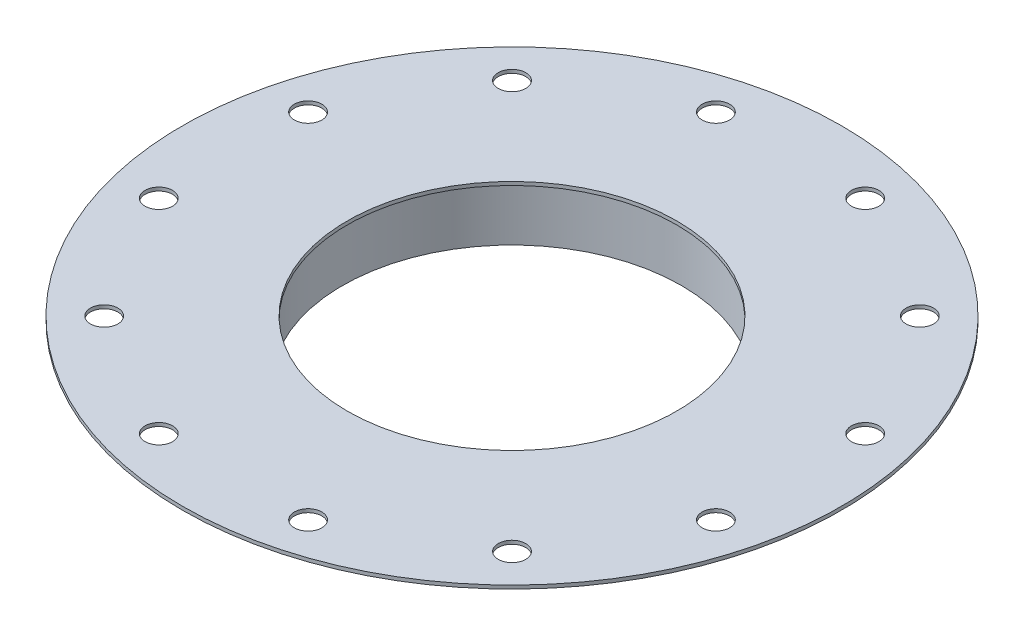
ISO-10303-21;
HEADER;
FILE_DESCRIPTION(('STEP AP214'),'2;1');
FILE_NAME('part.step','',(''),(''),'','','');
FILE_SCHEMA(('AUTOMOTIVE_DESIGN { 1 0 10303 214 1 1 1 1 }'));
ENDSEC;
DATA;
#1=APPLICATION_CONTEXT('core data for automotive mechanical design processes');
#2=APPLICATION_PROTOCOL_DEFINITION('international standard','automotive_design',2000,#1);
#3=PRODUCT_CONTEXT('',#1,'mechanical');
#4=PRODUCT('Part','Part','',(#3));
#5=PRODUCT_RELATED_PRODUCT_CATEGORY('part','',(#4));
#6=PRODUCT_DEFINITION_FORMATION('','',#4);
#7=PRODUCT_DEFINITION_CONTEXT('part definition',#1,'design');
#8=PRODUCT_DEFINITION('design','',#6,#7);
#9=PRODUCT_DEFINITION_SHAPE('','',#8);
#10=(LENGTH_UNIT() NAMED_UNIT(*) SI_UNIT(.MILLI.,.METRE.));
#11=(NAMED_UNIT(*) PLANE_ANGLE_UNIT() SI_UNIT($,.RADIAN.));
#12=(NAMED_UNIT(*) SI_UNIT($,.STERADIAN.) SOLID_ANGLE_UNIT());
#13=UNCERTAINTY_MEASURE_WITH_UNIT(LENGTH_MEASURE(1.E-05),#10,'distance_accuracy_value','');
#14=(GEOMETRIC_REPRESENTATION_CONTEXT(3) GLOBAL_UNCERTAINTY_ASSIGNED_CONTEXT((#13)) GLOBAL_UNIT_ASSIGNED_CONTEXT((#10,
#11,#12)) REPRESENTATION_CONTEXT('',''));
#15=CARTESIAN_POINT('',(0.,0.,0.));
#16=DIRECTION('',(0.,0.,1.));
#17=DIRECTION('',(1.,0.,0.));
#18=AXIS2_PLACEMENT_3D('',#15,#16,#17);
#19=CARTESIAN_POINT('',(0.,0.,0.));
#20=DIRECTION('',(0.,1.,0.));
#21=DIRECTION('',(0.,0.,1.));
#22=AXIS2_PLACEMENT_3D('',#19,#20,#21);
#23=PLANE('',#22);
#24=CARTESIAN_POINT('',(0.,0.,0.));
#25=DIRECTION('',(0.,1.,0.));
#26=DIRECTION('',(0.,0.,1.));
#27=AXIS2_PLACEMENT_3D('',#24,#25,#26);
#28=CIRCLE('',#27,300.);
#29=CARTESIAN_POINT('',(0.,0.,300.));
#30=VERTEX_POINT('',#29);
#31=EDGE_CURVE('E89',#30,#30,#28,.F.);
#32=ORIENTED_EDGE('',*,*,#31,.F.);
#33=EDGE_LOOP('',(#32));
#34=FACE_BOUND('',#33,.T.);
#35=CARTESIAN_POINT('',(0.,0.,0.));
#36=DIRECTION('',(0.,-1.,0.));
#37=DIRECTION('',(0.,0.,-1.));
#38=AXIS2_PLACEMENT_3D('',#35,#36,#37);
#39=CIRCLE('',#38,308.65);
#40=CARTESIAN_POINT('',(0.,0.,-308.65));
#41=VERTEX_POINT('',#40);
#42=EDGE_CURVE('E174',#41,#41,#39,.T.);
#43=ORIENTED_EDGE('',*,*,#42,.T.);
#44=EDGE_LOOP('',(#43));
#45=FACE_BOUND('',#44,.T.);
#46=ADVANCED_FACE('F69',(#34,#45),#23,.F.);
#47=CARTESIAN_POINT('',(0.,6.35,0.));
#48=DIRECTION('',(0.,-1.,0.));
#49=DIRECTION('',(0.,0.,-1.));
#50=AXIS2_PLACEMENT_3D('',#47,#48,#49);
#51=CYLINDRICAL_SURFACE('',#50,600.);
#52=CARTESIAN_POINT('',(0.,0.,0.));
#53=DIRECTION('',(0.,1.,0.));
#54=DIRECTION('',(0.,0.,1.));
#55=AXIS2_PLACEMENT_3D('',#52,#53,#54);
#56=CIRCLE('',#55,600.);
#57=CARTESIAN_POINT('',(0.,0.,600.));
#58=VERTEX_POINT('',#57);
#59=EDGE_CURVE('E85',#58,#58,#56,.T.);
#60=ORIENTED_EDGE('',*,*,#59,.T.);
#61=EDGE_LOOP('',(#60));
#62=FACE_BOUND('',#61,.T.);
#63=CARTESIAN_POINT('',(0.,6.35,0.));
#64=DIRECTION('',(0.,1.,0.));
#65=DIRECTION('',(0.,0.,1.));
#66=AXIS2_PLACEMENT_3D('',#63,#64,#65);
#67=CIRCLE('',#66,600.);
#68=CARTESIAN_POINT('',(0.,6.35,600.));
#69=VERTEX_POINT('',#68);
#70=EDGE_CURVE('E76',#69,#69,#67,.T.);
#71=ORIENTED_EDGE('',*,*,#70,.F.);
#72=EDGE_LOOP('',(#71));
#73=FACE_BOUND('',#72,.T.);
#74=ADVANCED_FACE('F140',(#62,#73),#51,.T.);
#75=CARTESIAN_POINT('',(0.,6.35,0.));
#76=DIRECTION('',(0.,-1.,0.));
#77=DIRECTION('',(0.,0.,-1.));
#78=AXIS2_PLACEMENT_3D('',#75,#76,#77);
#79=CYLINDRICAL_SURFACE('',#78,300.);
#80=CARTESIAN_POINT('',(0.,6.35,0.));
#81=DIRECTION('',(0.,1.,0.));
#82=DIRECTION('',(0.,0.,1.));
#83=AXIS2_PLACEMENT_3D('',#80,#81,#82);
#84=CIRCLE('',#83,300.);
#85=CARTESIAN_POINT('',(0.,6.35,300.));
#86=VERTEX_POINT('',#85);
#87=EDGE_CURVE('E80',#86,#86,#84,.F.);
#88=ORIENTED_EDGE('',*,*,#87,.F.);
#89=EDGE_LOOP('',(#88));
#90=FACE_BOUND('',#89,.T.);
#91=ORIENTED_EDGE('',*,*,#31,.T.);
#92=EDGE_LOOP('',(#91));
#93=FACE_BOUND('',#92,.T.);
#94=ADVANCED_FACE('F71',(#90,#93),#79,.F.);
#95=CARTESIAN_POINT('',(0.,0.,0.));
#96=DIRECTION('',(0.,1.,0.));
#97=DIRECTION('',(0.,0.,1.));
#98=AXIS2_PLACEMENT_3D('',#95,#96,#97);
#99=CIRCLE('',#98,315.);
#100=CARTESIAN_POINT('',(0.,0.,315.));
#101=VERTEX_POINT('',#100);
#102=EDGE_CURVE('E11',#101,#101,#99,.F.);
#103=ORIENTED_EDGE('',*,*,#102,.F.);
#104=EDGE_LOOP('',(#103));
#105=FACE_BOUND('',#104,.T.);
#106=CARTESIAN_POINT('',(-507.111058801756,0.,-135.879998678842));
#107=DIRECTION('',(0.,1.,0.));
#108=DIRECTION('',(0.,0.,1.));
#109=AXIS2_PLACEMENT_3D('',#106,#107,#108);
#110=CIRCLE('',#109,25.);
#111=CARTESIAN_POINT('',(-507.111058801756,0.,-110.879998678842));
#112=VERTEX_POINT('',#111);
#113=EDGE_CURVE('E188',#112,#112,#110,.T.);
#114=ORIENTED_EDGE('',*,*,#113,.T.);
#115=EDGE_LOOP('',(#114));
#116=FACE_BOUND('',#115,.T.);
#117=CARTESIAN_POINT('',(135.879998678691,0.,507.111058801796));
#118=DIRECTION('',(0.,1.,0.));
#119=DIRECTION('',(0.,0.,1.));
#120=AXIS2_PLACEMENT_3D('',#117,#118,#119);
#121=CIRCLE('',#120,25.);
#122=CARTESIAN_POINT('',(135.879998678691,0.,532.111058801796));
#123=VERTEX_POINT('',#122);
#124=EDGE_CURVE('E201',#123,#123,#121,.T.);
#125=ORIENTED_EDGE('',*,*,#124,.T.);
#126=EDGE_LOOP('',(#125));
#127=FACE_BOUND('',#126,.T.);
#128=CARTESIAN_POINT('',(371.23106012286,0.,371.231060123015));
#129=DIRECTION('',(0.,1.,0.));
#130=DIRECTION('',(0.,0.,1.));
#131=AXIS2_PLACEMENT_3D('',#128,#129,#130);
#132=CIRCLE('',#131,25.0000000000001);
#133=CARTESIAN_POINT('',(371.23106012286,0.,396.231060123015));
#134=VERTEX_POINT('',#133);
#135=EDGE_CURVE('E198',#134,#134,#132,.T.);
#136=ORIENTED_EDGE('',*,*,#135,.T.);
#137=EDGE_LOOP('',(#136));
#138=FACE_BOUND('',#137,.T.);
#139=CARTESIAN_POINT('',(507.11105880174,0.,135.879998678902));
#140=DIRECTION('',(0.,1.,0.));
#141=DIRECTION('',(0.,0.,1.));
#142=AXIS2_PLACEMENT_3D('',#139,#140,#141);
#143=CIRCLE('',#142,25.);
#144=CARTESIAN_POINT('',(507.11105880174,0.,160.879998678902));
#145=VERTEX_POINT('',#144);
#146=EDGE_CURVE('E194',#145,#145,#143,.T.);
#147=ORIENTED_EDGE('',*,*,#146,.T.);
#148=EDGE_LOOP('',(#147));
#149=FACE_BOUND('',#148,.T.);
#150=CARTESIAN_POINT('',(507.111058801775,0.,-135.879998678772));
#151=DIRECTION('',(0.,1.,0.));
#152=DIRECTION('',(0.,0.,1.));
#153=AXIS2_PLACEMENT_3D('',#150,#151,#152);
#154=CIRCLE('',#153,25.);
#155=CARTESIAN_POINT('',(507.111058801775,0.,-110.879998678773));
#156=VERTEX_POINT('',#155);
#157=EDGE_CURVE('E197',#156,#156,#154,.T.);
#158=ORIENTED_EDGE('',*,*,#157,.T.);
#159=EDGE_LOOP('',(#158));
#160=FACE_BOUND('',#159,.T.);
#161=CARTESIAN_POINT('',(371.231060122955,0.,-371.23106012292));
#162=DIRECTION('',(0.,1.,0.));
#163=DIRECTION('',(0.,0.,1.));
#164=AXIS2_PLACEMENT_3D('',#161,#162,#163);
#165=CIRCLE('',#164,25.0000000000001);
#166=CARTESIAN_POINT('',(371.231060122955,0.,-346.23106012292));
#167=VERTEX_POINT('',#166);
#168=EDGE_CURVE('E212',#167,#167,#165,.T.);
#169=ORIENTED_EDGE('',*,*,#168,.T.);
#170=EDGE_LOOP('',(#169));
#171=FACE_BOUND('',#170,.T.);
#172=CARTESIAN_POINT('',(-371.231060122929,0.,-371.231060122946));
#173=DIRECTION('',(0.,1.,0.));
#174=DIRECTION('',(0.,0.,1.));
#175=AXIS2_PLACEMENT_3D('',#172,#173,#174);
#176=CIRCLE('',#175,24.9999999999999);
#177=CARTESIAN_POINT('',(-371.231060122929,0.,-346.231060122946));
#178=VERTEX_POINT('',#177);
#179=EDGE_CURVE('E209',#178,#178,#176,.T.);
#180=ORIENTED_EDGE('',*,*,#179,.T.);
#181=EDGE_LOOP('',(#180));
#182=FACE_BOUND('',#181,.T.);
#183=CARTESIAN_POINT('',(-135.879998678819,0.,-507.111058801762));
#184=DIRECTION('',(0.,1.,0.));
#185=DIRECTION('',(0.,0.,1.));
#186=AXIS2_PLACEMENT_3D('',#183,#184,#185);
#187=CIRCLE('',#186,25.0000000000001);
#188=CARTESIAN_POINT('',(-135.879998678819,0.,-482.111058801762));
#189=VERTEX_POINT('',#188);
#190=EDGE_CURVE('E206',#189,#189,#187,.T.);
#191=ORIENTED_EDGE('',*,*,#190,.T.);
#192=EDGE_LOOP('',(#191));
#193=FACE_BOUND('',#192,.T.);
#194=CARTESIAN_POINT('',(-507.111058801768,0.,135.879998678797));
#195=DIRECTION('',(0.,1.,0.));
#196=DIRECTION('',(0.,0.,1.));
#197=AXIS2_PLACEMENT_3D('',#194,#195,#196);
#198=CIRCLE('',#197,25.);
#199=CARTESIAN_POINT('',(-507.111058801768,0.,160.879998678797));
#200=VERTEX_POINT('',#199);
#201=EDGE_CURVE('E185',#200,#200,#198,.T.);
#202=ORIENTED_EDGE('',*,*,#201,.T.);
#203=EDGE_LOOP('',(#202));
#204=FACE_BOUND('',#203,.T.);
#205=CARTESIAN_POINT('',(-371.231060122962,0.,371.231060122913));
#206=DIRECTION('',(0.,1.,0.));
#207=DIRECTION('',(0.,0.,1.));
#208=AXIS2_PLACEMENT_3D('',#205,#206,#207);
#209=CIRCLE('',#208,25.);
#210=CARTESIAN_POINT('',(-371.231060122962,0.,396.231060122913));
#211=VERTEX_POINT('',#210);
#212=EDGE_CURVE('E189',#211,#211,#209,.T.);
#213=ORIENTED_EDGE('',*,*,#212,.T.);
#214=EDGE_LOOP('',(#213));
#215=FACE_BOUND('',#214,.T.);
#216=CARTESIAN_POINT('',(-135.879998678864,0.,507.11105880175));
#217=DIRECTION('',(0.,1.,0.));
#218=DIRECTION('',(0.,0.,1.));
#219=AXIS2_PLACEMENT_3D('',#216,#217,#218);
#220=CIRCLE('',#219,25.);
#221=CARTESIAN_POINT('',(-135.879998678864,0.,532.11105880175));
#222=VERTEX_POINT('',#221);
#223=EDGE_CURVE('E184',#222,#222,#220,.T.);
#224=ORIENTED_EDGE('',*,*,#223,.T.);
#225=EDGE_LOOP('',(#224));
#226=FACE_BOUND('',#225,.T.);
#227=CARTESIAN_POINT('',(135.87999867882,0.,-507.111058801762));
#228=DIRECTION('',(0.,1.,0.));
#229=DIRECTION('',(0.,0.,1.));
#230=AXIS2_PLACEMENT_3D('',#227,#228,#229);
#231=CIRCLE('',#230,25.0000000000001);
#232=CARTESIAN_POINT('',(135.87999867882,0.,-482.111058801762));
#233=VERTEX_POINT('',#232);
#234=EDGE_CURVE('E99',#233,#233,#231,.T.);
#235=ORIENTED_EDGE('',*,*,#234,.T.);
#236=EDGE_LOOP('',(#235));
#237=FACE_BOUND('',#236,.T.);
#238=ORIENTED_EDGE('',*,*,#59,.F.);
#239=EDGE_LOOP('',(#238));
#240=FACE_BOUND('',#239,.T.);
#241=ADVANCED_FACE('F138',(#105,#116,#127,#138,#149,#160,#171,#182,#193,#204,#215,#226,#237,
#240),#23,.F.);
#242=CARTESIAN_POINT('',(0.,6.35,0.));
#243=DIRECTION('',(0.,1.,0.));
#244=DIRECTION('',(0.,0.,1.));
#245=AXIS2_PLACEMENT_3D('',#242,#243,#244);
#246=PLANE('',#245);
#247=CARTESIAN_POINT('',(-507.111058801756,6.35,-135.879998678842));
#248=DIRECTION('',(0.,1.,0.));
#249=DIRECTION('',(0.,0.,1.));
#250=AXIS2_PLACEMENT_3D('',#247,#248,#249);
#251=CIRCLE('',#250,25.);
#252=CARTESIAN_POINT('',(-507.111058801756,6.35,-110.879998678842));
#253=VERTEX_POINT('',#252);
#254=EDGE_CURVE('E92',#253,#253,#251,.T.);
#255=ORIENTED_EDGE('',*,*,#254,.F.);
#256=EDGE_LOOP('',(#255));
#257=FACE_BOUND('',#256,.T.);
#258=CARTESIAN_POINT('',(135.879998678691,6.35,507.111058801796));
#259=DIRECTION('',(0.,1.,0.));
#260=DIRECTION('',(0.,0.,1.));
#261=AXIS2_PLACEMENT_3D('',#258,#259,#260);
#262=CIRCLE('',#261,25.);
#263=CARTESIAN_POINT('',(135.879998678691,6.35,532.111058801796));
#264=VERTEX_POINT('',#263);
#265=EDGE_CURVE('E126',#264,#264,#262,.T.);
#266=ORIENTED_EDGE('',*,*,#265,.F.);
#267=EDGE_LOOP('',(#266));
#268=FACE_BOUND('',#267,.T.);
#269=CARTESIAN_POINT('',(371.23106012286,6.35,371.231060123015));
#270=DIRECTION('',(0.,1.,0.));
#271=DIRECTION('',(0.,0.,1.));
#272=AXIS2_PLACEMENT_3D('',#269,#270,#271);
#273=CIRCLE('',#272,25.0000000000001);
#274=CARTESIAN_POINT('',(371.23106012286,6.35,396.231060123015));
#275=VERTEX_POINT('',#274);
#276=EDGE_CURVE('E123',#275,#275,#273,.T.);
#277=ORIENTED_EDGE('',*,*,#276,.F.);
#278=EDGE_LOOP('',(#277));
#279=FACE_BOUND('',#278,.T.);
#280=CARTESIAN_POINT('',(507.11105880174,6.35,135.879998678902));
#281=DIRECTION('',(0.,1.,0.));
#282=DIRECTION('',(0.,0.,1.));
#283=AXIS2_PLACEMENT_3D('',#280,#281,#282);
#284=CIRCLE('',#283,25.);
#285=CARTESIAN_POINT('',(507.11105880174,6.35,160.879998678902));
#286=VERTEX_POINT('',#285);
#287=EDGE_CURVE('E120',#286,#286,#284,.T.);
#288=ORIENTED_EDGE('',*,*,#287,.F.);
#289=EDGE_LOOP('',(#288));
#290=FACE_BOUND('',#289,.T.);
#291=CARTESIAN_POINT('',(507.111058801775,6.35,-135.879998678772));
#292=DIRECTION('',(0.,1.,0.));
#293=DIRECTION('',(0.,0.,1.));
#294=AXIS2_PLACEMENT_3D('',#291,#292,#293);
#295=CIRCLE('',#294,25.);
#296=CARTESIAN_POINT('',(507.111058801775,6.35,-110.879998678773));
#297=VERTEX_POINT('',#296);
#298=EDGE_CURVE('E117',#297,#297,#295,.T.);
#299=ORIENTED_EDGE('',*,*,#298,.F.);
#300=EDGE_LOOP('',(#299));
#301=FACE_BOUND('',#300,.T.);
#302=CARTESIAN_POINT('',(371.231060122955,6.35,-371.23106012292));
#303=DIRECTION('',(0.,1.,0.));
#304=DIRECTION('',(0.,0.,1.));
#305=AXIS2_PLACEMENT_3D('',#302,#303,#304);
#306=CIRCLE('',#305,25.0000000000001);
#307=CARTESIAN_POINT('',(371.231060122955,6.35,-346.23106012292));
#308=VERTEX_POINT('',#307);
#309=EDGE_CURVE('E114',#308,#308,#306,.T.);
#310=ORIENTED_EDGE('',*,*,#309,.F.);
#311=EDGE_LOOP('',(#310));
#312=FACE_BOUND('',#311,.T.);
#313=CARTESIAN_POINT('',(-371.231060122929,6.35,-371.231060122946));
#314=DIRECTION('',(0.,1.,0.));
#315=DIRECTION('',(0.,0.,1.));
#316=AXIS2_PLACEMENT_3D('',#313,#314,#315);
#317=CIRCLE('',#316,24.9999999999999);
#318=CARTESIAN_POINT('',(-371.231060122929,6.35,-346.231060122946));
#319=VERTEX_POINT('',#318);
#320=EDGE_CURVE('E111',#319,#319,#317,.T.);
#321=ORIENTED_EDGE('',*,*,#320,.F.);
#322=EDGE_LOOP('',(#321));
#323=FACE_BOUND('',#322,.T.);
#324=CARTESIAN_POINT('',(-135.879998678819,6.35,-507.111058801762));
#325=DIRECTION('',(0.,1.,0.));
#326=DIRECTION('',(0.,0.,1.));
#327=AXIS2_PLACEMENT_3D('',#324,#325,#326);
#328=CIRCLE('',#327,25.0000000000001);
#329=CARTESIAN_POINT('',(-135.879998678819,6.35,-482.111058801762));
#330=VERTEX_POINT('',#329);
#331=EDGE_CURVE('E108',#330,#330,#328,.T.);
#332=ORIENTED_EDGE('',*,*,#331,.F.);
#333=EDGE_LOOP('',(#332));
#334=FACE_BOUND('',#333,.T.);
#335=CARTESIAN_POINT('',(-507.111058801768,6.35,135.879998678797));
#336=DIRECTION('',(0.,1.,0.));
#337=DIRECTION('',(0.,0.,1.));
#338=AXIS2_PLACEMENT_3D('',#335,#336,#337);
#339=CIRCLE('',#338,25.);
#340=CARTESIAN_POINT('',(-507.111058801768,6.35,160.879998678797));
#341=VERTEX_POINT('',#340);
#342=EDGE_CURVE('E105',#341,#341,#339,.T.);
#343=ORIENTED_EDGE('',*,*,#342,.F.);
#344=EDGE_LOOP('',(#343));
#345=FACE_BOUND('',#344,.T.);
#346=CARTESIAN_POINT('',(-371.231060122962,6.35,371.231060122913));
#347=DIRECTION('',(0.,1.,0.));
#348=DIRECTION('',(0.,0.,1.));
#349=AXIS2_PLACEMENT_3D('',#346,#347,#348);
#350=CIRCLE('',#349,25.);
#351=CARTESIAN_POINT('',(-371.231060122962,6.35,396.231060122913));
#352=VERTEX_POINT('',#351);
#353=EDGE_CURVE('E102',#352,#352,#350,.T.);
#354=ORIENTED_EDGE('',*,*,#353,.F.);
#355=EDGE_LOOP('',(#354));
#356=FACE_BOUND('',#355,.T.);
#357=CARTESIAN_POINT('',(-135.879998678864,6.35,507.11105880175));
#358=DIRECTION('',(0.,1.,0.));
#359=DIRECTION('',(0.,0.,1.));
#360=AXIS2_PLACEMENT_3D('',#357,#358,#359);
#361=CIRCLE('',#360,25.);
#362=CARTESIAN_POINT('',(-135.879998678864,6.35,532.11105880175));
#363=VERTEX_POINT('',#362);
#364=EDGE_CURVE('E98',#363,#363,#361,.T.);
#365=ORIENTED_EDGE('',*,*,#364,.F.);
#366=EDGE_LOOP('',(#365));
#367=FACE_BOUND('',#366,.T.);
#368=CARTESIAN_POINT('',(135.87999867882,6.35,-507.111058801762));
#369=DIRECTION('',(0.,1.,0.));
#370=DIRECTION('',(0.,0.,1.));
#371=AXIS2_PLACEMENT_3D('',#368,#369,#370);
#372=CIRCLE('',#371,25.0000000000001);
#373=CARTESIAN_POINT('',(135.87999867882,6.35,-482.111058801762));
#374=VERTEX_POINT('',#373);
#375=EDGE_CURVE('E95',#374,#374,#372,.T.);
#376=ORIENTED_EDGE('',*,*,#375,.F.);
#377=EDGE_LOOP('',(#376));
#378=FACE_BOUND('',#377,.T.);
#379=ORIENTED_EDGE('',*,*,#70,.T.);
#380=EDGE_LOOP('',(#379));
#381=FACE_BOUND('',#380,.T.);
#382=ORIENTED_EDGE('',*,*,#87,.T.);
#383=EDGE_LOOP('',(#382));
#384=FACE_BOUND('',#383,.T.);
#385=ADVANCED_FACE('F134',(#257,#268,#279,#290,#301,#312,#323,#334,#345,#356,#367,#378,#381,
#384),#246,.T.);
#386=CARTESIAN_POINT('',(135.87999867882,0.,-507.111058801762));
#387=DIRECTION('',(0.,1.,0.));
#388=DIRECTION('',(0.,0.,1.));
#389=AXIS2_PLACEMENT_3D('',#386,#387,#388);
#390=CYLINDRICAL_SURFACE('',#389,25.0000000000001);
#391=ORIENTED_EDGE('',*,*,#375,.T.);
#392=EDGE_LOOP('',(#391));
#393=FACE_BOUND('',#392,.T.);
#394=ORIENTED_EDGE('',*,*,#234,.F.);
#395=EDGE_LOOP('',(#394));
#396=FACE_BOUND('',#395,.T.);
#397=ADVANCED_FACE('F137',(#393,#396),#390,.F.);
#398=CARTESIAN_POINT('',(-135.879998678864,0.,507.11105880175));
#399=DIRECTION('',(0.,1.,0.));
#400=DIRECTION('',(0.,0.,1.));
#401=AXIS2_PLACEMENT_3D('',#398,#399,#400);
#402=CYLINDRICAL_SURFACE('',#401,25.);
#403=ORIENTED_EDGE('',*,*,#364,.T.);
#404=EDGE_LOOP('',(#403));
#405=FACE_BOUND('',#404,.T.);
#406=ORIENTED_EDGE('',*,*,#223,.F.);
#407=EDGE_LOOP('',(#406));
#408=FACE_BOUND('',#407,.T.);
#409=ADVANCED_FACE('F222',(#405,#408),#402,.F.);
#410=CARTESIAN_POINT('',(-371.231060122962,0.,371.231060122913));
#411=DIRECTION('',(0.,1.,0.));
#412=DIRECTION('',(0.,0.,1.));
#413=AXIS2_PLACEMENT_3D('',#410,#411,#412);
#414=CYLINDRICAL_SURFACE('',#413,25.);
#415=ORIENTED_EDGE('',*,*,#353,.T.);
#416=EDGE_LOOP('',(#415));
#417=FACE_BOUND('',#416,.T.);
#418=ORIENTED_EDGE('',*,*,#212,.F.);
#419=EDGE_LOOP('',(#418));
#420=FACE_BOUND('',#419,.T.);
#421=ADVANCED_FACE('F228',(#417,#420),#414,.F.);
#422=CARTESIAN_POINT('',(-507.111058801768,0.,135.879998678797));
#423=DIRECTION('',(0.,1.,0.));
#424=DIRECTION('',(0.,0.,1.));
#425=AXIS2_PLACEMENT_3D('',#422,#423,#424);
#426=CYLINDRICAL_SURFACE('',#425,25.);
#427=ORIENTED_EDGE('',*,*,#342,.T.);
#428=EDGE_LOOP('',(#427));
#429=FACE_BOUND('',#428,.T.);
#430=ORIENTED_EDGE('',*,*,#201,.F.);
#431=EDGE_LOOP('',(#430));
#432=FACE_BOUND('',#431,.T.);
#433=ADVANCED_FACE('F266',(#429,#432),#426,.F.);
#434=CARTESIAN_POINT('',(-135.879998678819,0.,-507.111058801762));
#435=DIRECTION('',(0.,1.,0.));
#436=DIRECTION('',(0.,0.,1.));
#437=AXIS2_PLACEMENT_3D('',#434,#435,#436);
#438=CYLINDRICAL_SURFACE('',#437,25.0000000000001);
#439=ORIENTED_EDGE('',*,*,#331,.T.);
#440=EDGE_LOOP('',(#439));
#441=FACE_BOUND('',#440,.T.);
#442=ORIENTED_EDGE('',*,*,#190,.F.);
#443=EDGE_LOOP('',(#442));
#444=FACE_BOUND('',#443,.T.);
#445=ADVANCED_FACE('F272',(#441,#444),#438,.F.);
#446=CARTESIAN_POINT('',(-371.231060122929,0.,-371.231060122946));
#447=DIRECTION('',(0.,1.,0.));
#448=DIRECTION('',(0.,0.,1.));
#449=AXIS2_PLACEMENT_3D('',#446,#447,#448);
#450=CYLINDRICAL_SURFACE('',#449,24.9999999999999);
#451=ORIENTED_EDGE('',*,*,#320,.T.);
#452=EDGE_LOOP('',(#451));
#453=FACE_BOUND('',#452,.T.);
#454=ORIENTED_EDGE('',*,*,#179,.F.);
#455=EDGE_LOOP('',(#454));
#456=FACE_BOUND('',#455,.T.);
#457=ADVANCED_FACE('F295',(#453,#456),#450,.F.);
#458=CARTESIAN_POINT('',(371.231060122955,0.,-371.23106012292));
#459=DIRECTION('',(0.,1.,0.));
#460=DIRECTION('',(0.,0.,1.));
#461=AXIS2_PLACEMENT_3D('',#458,#459,#460);
#462=CYLINDRICAL_SURFACE('',#461,25.0000000000001);
#463=ORIENTED_EDGE('',*,*,#309,.T.);
#464=EDGE_LOOP('',(#463));
#465=FACE_BOUND('',#464,.T.);
#466=ORIENTED_EDGE('',*,*,#168,.F.);
#467=EDGE_LOOP('',(#466));
#468=FACE_BOUND('',#467,.T.);
#469=ADVANCED_FACE('F299',(#465,#468),#462,.F.);
#470=CARTESIAN_POINT('',(507.111058801775,0.,-135.879998678772));
#471=DIRECTION('',(0.,1.,0.));
#472=DIRECTION('',(0.,0.,1.));
#473=AXIS2_PLACEMENT_3D('',#470,#471,#472);
#474=CYLINDRICAL_SURFACE('',#473,25.);
#475=ORIENTED_EDGE('',*,*,#298,.T.);
#476=EDGE_LOOP('',(#475));
#477=FACE_BOUND('',#476,.T.);
#478=ORIENTED_EDGE('',*,*,#157,.F.);
#479=EDGE_LOOP('',(#478));
#480=FACE_BOUND('',#479,.T.);
#481=ADVANCED_FACE('F281',(#477,#480),#474,.F.);
#482=CARTESIAN_POINT('',(507.11105880174,0.,135.879998678902));
#483=DIRECTION('',(0.,1.,0.));
#484=DIRECTION('',(0.,0.,1.));
#485=AXIS2_PLACEMENT_3D('',#482,#483,#484);
#486=CYLINDRICAL_SURFACE('',#485,25.);
#487=ORIENTED_EDGE('',*,*,#287,.T.);
#488=EDGE_LOOP('',(#487));
#489=FACE_BOUND('',#488,.T.);
#490=ORIENTED_EDGE('',*,*,#146,.F.);
#491=EDGE_LOOP('',(#490));
#492=FACE_BOUND('',#491,.T.);
#493=ADVANCED_FACE('F277',(#489,#492),#486,.F.);
#494=CARTESIAN_POINT('',(371.23106012286,0.,371.231060123015));
#495=DIRECTION('',(0.,1.,0.));
#496=DIRECTION('',(0.,0.,1.));
#497=AXIS2_PLACEMENT_3D('',#494,#495,#496);
#498=CYLINDRICAL_SURFACE('',#497,25.0000000000001);
#499=ORIENTED_EDGE('',*,*,#276,.T.);
#500=EDGE_LOOP('',(#499));
#501=FACE_BOUND('',#500,.T.);
#502=ORIENTED_EDGE('',*,*,#135,.F.);
#503=EDGE_LOOP('',(#502));
#504=FACE_BOUND('',#503,.T.);
#505=ADVANCED_FACE('F280',(#501,#504),#498,.F.);
#506=CARTESIAN_POINT('',(135.879998678691,0.,507.111058801796));
#507=DIRECTION('',(0.,1.,0.));
#508=DIRECTION('',(0.,0.,1.));
#509=AXIS2_PLACEMENT_3D('',#506,#507,#508);
#510=CYLINDRICAL_SURFACE('',#509,25.);
#511=ORIENTED_EDGE('',*,*,#265,.T.);
#512=EDGE_LOOP('',(#511));
#513=FACE_BOUND('',#512,.T.);
#514=ORIENTED_EDGE('',*,*,#124,.F.);
#515=EDGE_LOOP('',(#514));
#516=FACE_BOUND('',#515,.T.);
#517=ADVANCED_FACE('F285',(#513,#516),#510,.F.);
#518=CARTESIAN_POINT('',(-507.111058801756,0.,-135.879998678842));
#519=DIRECTION('',(0.,1.,0.));
#520=DIRECTION('',(0.,0.,1.));
#521=AXIS2_PLACEMENT_3D('',#518,#519,#520);
#522=CYLINDRICAL_SURFACE('',#521,25.);
#523=ORIENTED_EDGE('',*,*,#254,.T.);
#524=EDGE_LOOP('',(#523));
#525=FACE_BOUND('',#524,.T.);
#526=ORIENTED_EDGE('',*,*,#113,.F.);
#527=EDGE_LOOP('',(#526));
#528=FACE_BOUND('',#527,.T.);
#529=ADVANCED_FACE('F131',(#525,#528),#522,.F.);
#530=CARTESIAN_POINT('',(0.,-100.,0.));
#531=DIRECTION('',(0.,-1.,0.));
#532=DIRECTION('',(0.,0.,-1.));
#533=AXIS2_PLACEMENT_3D('',#530,#531,#532);
#534=PLANE('',#533);
#535=CARTESIAN_POINT('',(0.,-100.,0.));
#536=DIRECTION('',(0.,-1.,0.));
#537=DIRECTION('',(0.,0.,-1.));
#538=AXIS2_PLACEMENT_3D('',#535,#536,#537);
#539=CIRCLE('',#538,315.);
#540=CARTESIAN_POINT('',(0.,-100.,-315.));
#541=VERTEX_POINT('',#540);
#542=EDGE_CURVE('E179',#541,#541,#539,.T.);
#543=ORIENTED_EDGE('',*,*,#542,.T.);
#544=EDGE_LOOP('',(#543));
#545=FACE_BOUND('',#544,.T.);
#546=CARTESIAN_POINT('',(0.,-100.,0.));
#547=DIRECTION('',(0.,-1.,0.));
#548=DIRECTION('',(0.,0.,-1.));
#549=AXIS2_PLACEMENT_3D('',#546,#547,#548);
#550=CIRCLE('',#549,308.65);
#551=CARTESIAN_POINT('',(0.,-100.,-308.65));
#552=VERTEX_POINT('',#551);
#553=EDGE_CURVE('E176',#552,#552,#550,.T.);
#554=ORIENTED_EDGE('',*,*,#553,.F.);
#555=EDGE_LOOP('',(#554));
#556=FACE_BOUND('',#555,.T.);
#557=ADVANCED_FACE('F292',(#545,#556),#534,.T.);
#558=CARTESIAN_POINT('',(0.,-100.,0.));
#559=DIRECTION('',(0.,1.,0.));
#560=DIRECTION('',(0.,0.,1.));
#561=AXIS2_PLACEMENT_3D('',#558,#559,#560);
#562=CYLINDRICAL_SURFACE('',#561,315.);
#563=ORIENTED_EDGE('',*,*,#542,.F.);
#564=EDGE_LOOP('',(#563));
#565=FACE_BOUND('',#564,.T.);
#566=ORIENTED_EDGE('',*,*,#102,.T.);
#567=EDGE_LOOP('',(#566));
#568=FACE_BOUND('',#567,.T.);
#569=ADVANCED_FACE('F333',(#565,#568),#562,.T.);
#570=CARTESIAN_POINT('',(0.,-100.,0.));
#571=DIRECTION('',(0.,1.,0.));
#572=DIRECTION('',(0.,0.,1.));
#573=AXIS2_PLACEMENT_3D('',#570,#571,#572);
#574=CYLINDRICAL_SURFACE('',#573,308.65);
#575=ORIENTED_EDGE('',*,*,#553,.T.);
#576=EDGE_LOOP('',(#575));
#577=FACE_BOUND('',#576,.T.);
#578=ORIENTED_EDGE('',*,*,#42,.F.);
#579=EDGE_LOOP('',(#578));
#580=FACE_BOUND('',#579,.T.);
#581=ADVANCED_FACE('F341',(#577,#580),#574,.F.);
#582=CLOSED_SHELL('',(#46,#74,#94,#241,#385,#397,#409,#421,#433,#445,#457,#469,#481,#493,#505,
#517,#529,#557,#569,#581));
#583=MANIFOLD_SOLID_BREP('B2',#582);
#584=ADVANCED_BREP_SHAPE_REPRESENTATION('',(#18,#583),#14);
#585=SHAPE_DEFINITION_REPRESENTATION(#9,#584);
ENDSEC;
END-ISO-10303-21;
